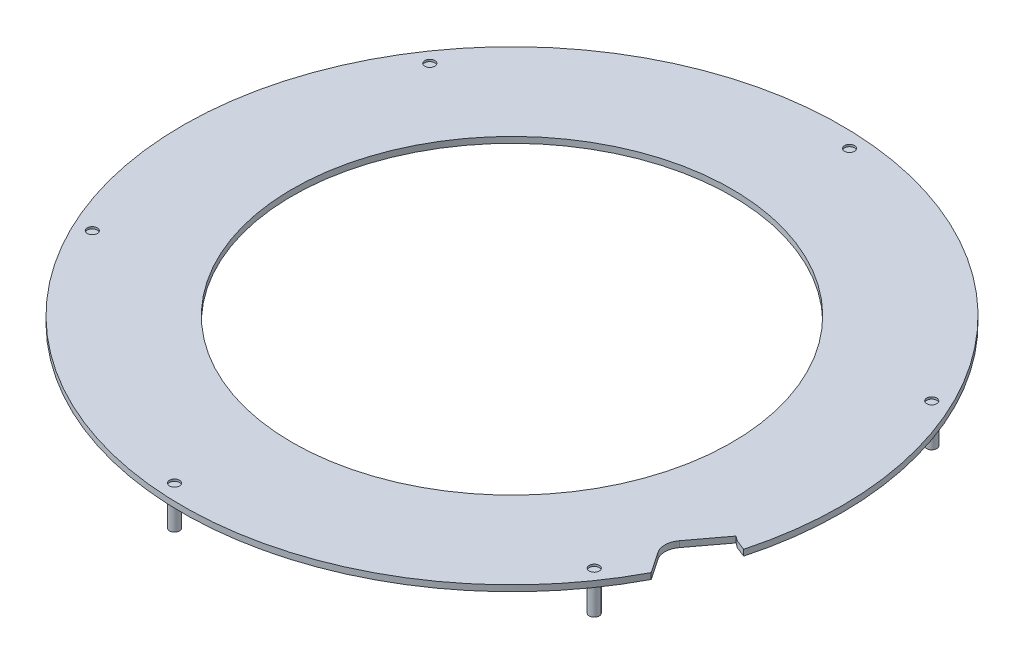
ISO-10303-21;
HEADER;
FILE_DESCRIPTION(('STEP AP214'),'2;1');
FILE_NAME('part.step','',(''),(''),'','','');
FILE_SCHEMA(('AUTOMOTIVE_DESIGN { 1 0 10303 214 1 1 1 1 }'));
ENDSEC;
DATA;
#1=APPLICATION_CONTEXT('core data for automotive mechanical design processes');
#2=APPLICATION_PROTOCOL_DEFINITION('international standard','automotive_design',2000,#1);
#3=PRODUCT_CONTEXT('',#1,'mechanical');
#4=PRODUCT('Part','Part','',(#3));
#5=PRODUCT_RELATED_PRODUCT_CATEGORY('part','',(#4));
#6=PRODUCT_DEFINITION_FORMATION('','',#4);
#7=PRODUCT_DEFINITION_CONTEXT('part definition',#1,'design');
#8=PRODUCT_DEFINITION('design','',#6,#7);
#9=PRODUCT_DEFINITION_SHAPE('','',#8);
#10=(LENGTH_UNIT() NAMED_UNIT(*) SI_UNIT(.MILLI.,.METRE.));
#11=(NAMED_UNIT(*) PLANE_ANGLE_UNIT() SI_UNIT($,.RADIAN.));
#12=(NAMED_UNIT(*) SI_UNIT($,.STERADIAN.) SOLID_ANGLE_UNIT());
#13=UNCERTAINTY_MEASURE_WITH_UNIT(LENGTH_MEASURE(1.E-05),#10,'distance_accuracy_value','');
#14=(GEOMETRIC_REPRESENTATION_CONTEXT(3) GLOBAL_UNCERTAINTY_ASSIGNED_CONTEXT((#13)) GLOBAL_UNIT_ASSIGNED_CONTEXT((#10,
#11,#12)) REPRESENTATION_CONTEXT('',''));
#15=CARTESIAN_POINT('',(0.,0.,0.));
#16=DIRECTION('',(0.,0.,1.));
#17=DIRECTION('',(1.,0.,0.));
#18=AXIS2_PLACEMENT_3D('',#15,#16,#17);
#19=CARTESIAN_POINT('',(0.,3.,0.));
#20=DIRECTION('',(0.,1.,0.));
#21=DIRECTION('',(0.,0.,1.));
#22=AXIS2_PLACEMENT_3D('',#19,#20,#21);
#23=PLANE('',#22);
#24=CARTESIAN_POINT('',(-130.034414333426,3.,-88.8667603154464));
#25=DIRECTION('',(0.,1.,0.));
#26=DIRECTION('',(0.86602540378444,0.,0.499999999999998));
#27=AXIS2_PLACEMENT_3D('',#24,#25,#26);
#28=CIRCLE('',#27,2.50000000000001);
#29=CARTESIAN_POINT('',(-127.869350823964,3.,-87.6167603154464));
#30=VERTEX_POINT('',#29);
#31=EDGE_CURVE('E325',#30,#30,#28,.T.);
#32=ORIENTED_EDGE('',*,*,#31,.F.);
#33=EDGE_LOOP('',(#32));
#34=FACE_BOUND('',#33,.T.);
#35=CARTESIAN_POINT('',(-141.978079151912,3.,68.179726021255));
#36=DIRECTION('',(0.,1.,0.));
#37=DIRECTION('',(0.866025403784436,0.,-0.500000000000004));
#38=AXIS2_PLACEMENT_3D('',#35,#36,#37);
#39=CIRCLE('',#38,2.50000000000001);
#40=CARTESIAN_POINT('',(-139.813015642451,3.,66.929726021255));
#41=VERTEX_POINT('',#40);
#42=EDGE_CURVE('E332',#41,#41,#39,.T.);
#43=ORIENTED_EDGE('',*,*,#42,.F.);
#44=EDGE_LOOP('',(#43));
#45=FACE_BOUND('',#44,.T.);
#46=CARTESIAN_POINT('',(-11.9436648184869,3.,157.046486336701));
#47=DIRECTION('',(0.,1.,0.));
#48=DIRECTION('',(0.,0.,-1.));
#49=AXIS2_PLACEMENT_3D('',#46,#47,#48);
#50=CIRCLE('',#49,2.50000000000001);
#51=CARTESIAN_POINT('',(-11.9436648184869,3.,154.546486336701));
#52=VERTEX_POINT('',#51);
#53=EDGE_CURVE('E338',#52,#52,#50,.T.);
#54=ORIENTED_EDGE('',*,*,#53,.F.);
#55=EDGE_LOOP('',(#54));
#56=FACE_BOUND('',#55,.T.);
#57=CARTESIAN_POINT('',(130.034414333426,3.,88.8667603154455));
#58=DIRECTION('',(0.,1.,0.));
#59=DIRECTION('',(-0.866025403784443,0.,-0.499999999999992));
#60=AXIS2_PLACEMENT_3D('',#57,#58,#59);
#61=CIRCLE('',#60,2.50000000000001);
#62=CARTESIAN_POINT('',(127.869350823965,3.,87.6167603154455));
#63=VERTEX_POINT('',#62);
#64=EDGE_CURVE('E344',#63,#63,#61,.T.);
#65=ORIENTED_EDGE('',*,*,#64,.F.);
#66=EDGE_LOOP('',(#65));
#67=FACE_BOUND('',#66,.T.);
#68=CARTESIAN_POINT('',(141.978079151912,3.,-68.179726021256));
#69=DIRECTION('',(0.,1.,0.));
#70=DIRECTION('',(-0.866025403784433,0.,0.50000000000001));
#71=AXIS2_PLACEMENT_3D('',#68,#69,#70);
#72=CIRCLE('',#71,2.50000000000001);
#73=CARTESIAN_POINT('',(139.81301564245,3.,-66.929726021256));
#74=VERTEX_POINT('',#73);
#75=EDGE_CURVE('E350',#74,#74,#72,.T.);
#76=ORIENTED_EDGE('',*,*,#75,.F.);
#77=EDGE_LOOP('',(#76));
#78=FACE_BOUND('',#77,.T.);
#79=CARTESIAN_POINT('',(11.9436648184869,3.,-157.046486336701));
#80=DIRECTION('',(0.,1.,0.));
#81=DIRECTION('',(0.,0.,1.));
#82=AXIS2_PLACEMENT_3D('',#79,#80,#81);
#83=CIRCLE('',#82,2.50000000000001);
#84=CARTESIAN_POINT('',(11.9436648184869,3.,-154.546486336701));
#85=VERTEX_POINT('',#84);
#86=EDGE_CURVE('E324',#85,#85,#83,.T.);
#87=ORIENTED_EDGE('',*,*,#86,.F.);
#88=EDGE_LOOP('',(#87));
#89=FACE_BOUND('',#88,.T.);
#90=DIRECTION('',(0.559555238153662,0.,0.828793059487589));
#91=VECTOR('',#90,1.);
#92=CARTESIAN_POINT('',(64.936029715868,3.,-43.8412160387546));
#93=LINE('',#92,#91);
#94=CARTESIAN_POINT('',(139.162211830197,3.,66.0999307399016));
#95=VERTEX_POINT('',#94);
#96=CARTESIAN_POINT('',(146.18965414879,3.,76.5087251224142));
#97=VERTEX_POINT('',#96);
#98=EDGE_CURVE('E128',#95,#97,#93,.T.);
#99=ORIENTED_EDGE('',*,*,#98,.F.);
#100=CARTESIAN_POINT('',(146.621349365585,3.,61.0639335965184));
#101=DIRECTION('',(0.,1.,0.));
#102=DIRECTION('',(0.,0.,1.));
#103=AXIS2_PLACEMENT_3D('',#100,#101,#102);
#104=CIRCLE('',#103,9.00000000000006);
#105=CARTESIAN_POINT('',(139.418207286111,3.,55.668125577054));
#106=VERTEX_POINT('',#105);
#107=EDGE_CURVE('E132',#106,#95,#104,.T.);
#108=ORIENTED_EDGE('',*,*,#107,.F.);
#109=DIRECTION('',(-0.599534224384919,0.,0.800349119941525));
#110=VECTOR('',#109,1.);
#111=CARTESIAN_POINT('',(116.017156590271,3.,86.907393609396));
#112=LINE('',#111,#110);
#113=CARTESIAN_POINT('',(151.593681380399,3.,39.4144580133197));
#114=VERTEX_POINT('',#113);
#115=EDGE_CURVE('E96',#114,#106,#112,.T.);
#116=ORIENTED_EDGE('',*,*,#115,.F.);
#117=DIRECTION('',(-0.800349119941534,0.,-0.599534224384908));
#118=VECTOR('',#117,1.);
#119=CARTESIAN_POINT('',(35.5765247901258,3.,-47.4929355960752));
#120=LINE('',#119,#118);
#121=CARTESIAN_POINT('',(153.89000031285,3.,41.1346095769374));
#122=VERTEX_POINT('',#121);
#123=EDGE_CURVE('E58',#122,#114,#120,.T.);
#124=ORIENTED_EDGE('',*,*,#123,.F.);
#125=DIRECTION('',(-0.927663239871869,0.,-0.373417880383931));
#126=VECTOR('',#125,1.);
#127=CARTESIAN_POINT('',(7.20928496421925,3.,-17.9096636727494));
#128=LINE('',#127,#126);
#129=CARTESIAN_POINT('',(159.222327431221,3.,43.2810633809398));
#130=VERTEX_POINT('',#129);
#131=EDGE_CURVE('E123',#130,#122,#128,.T.);
#132=ORIENTED_EDGE('',*,*,#131,.F.);
#133=CARTESIAN_POINT('',(0.,3.,0.));
#134=DIRECTION('',(0.,1.,0.));
#135=DIRECTION('',(0.,0.,1.));
#136=AXIS2_PLACEMENT_3D('',#133,#134,#135);
#137=CIRCLE('',#136,165.);
#138=EDGE_CURVE('E159',#130,#97,#137,.T.);
#139=ORIENTED_EDGE('',*,*,#138,.T.);
#140=EDGE_LOOP('',(#99,#108,#116,#124,#132,#139));
#141=FACE_BOUND('',#140,.T.);
#142=CARTESIAN_POINT('',(0.,3.,0.));
#143=DIRECTION('',(0.,1.,0.));
#144=DIRECTION('',(0.,0.,1.));
#145=AXIS2_PLACEMENT_3D('',#142,#143,#144);
#146=CIRCLE('',#145,110.);
#147=CARTESIAN_POINT('',(0.,3.,110.));
#148=VERTEX_POINT('',#147);
#149=EDGE_CURVE('E153',#148,#148,#146,.T.);
#150=ORIENTED_EDGE('',*,*,#149,.F.);
#151=EDGE_LOOP('',(#150));
#152=FACE_BOUND('',#151,.T.);
#153=ADVANCED_FACE('F35',(#34,#45,#56,#67,#78,#89,#141,#152),#23,.T.);
#154=CARTESIAN_POINT('',(0.,0.,0.));
#155=DIRECTION('',(0.,1.,0.));
#156=DIRECTION('',(0.,0.,1.));
#157=AXIS2_PLACEMENT_3D('',#154,#155,#156);
#158=PLANE('',#157);
#159=CARTESIAN_POINT('',(-141.978079151912,0.,68.179726021256));
#160=DIRECTION('',(0.,1.,0.));
#161=DIRECTION('',(0.,0.,1.));
#162=AXIS2_PLACEMENT_3D('',#159,#160,#161);
#163=CIRCLE('',#162,2.5);
#164=CARTESIAN_POINT('',(-141.978079151912,0.,70.679726021256));
#165=VERTEX_POINT('',#164);
#166=EDGE_CURVE('E179',#165,#165,#163,.F.);
#167=ORIENTED_EDGE('',*,*,#166,.F.);
#168=EDGE_LOOP('',(#167));
#169=FACE_BOUND('',#168,.T.);
#170=CARTESIAN_POINT('',(-130.034414333426,0.,-88.8667603154455));
#171=DIRECTION('',(0.,1.,0.));
#172=DIRECTION('',(0.,0.,1.));
#173=AXIS2_PLACEMENT_3D('',#170,#171,#172);
#174=CIRCLE('',#173,2.5);
#175=CARTESIAN_POINT('',(-130.034414333426,0.,-86.3667603154455));
#176=VERTEX_POINT('',#175);
#177=EDGE_CURVE('E176',#176,#176,#174,.F.);
#178=ORIENTED_EDGE('',*,*,#177,.F.);
#179=EDGE_LOOP('',(#178));
#180=FACE_BOUND('',#179,.T.);
#181=CARTESIAN_POINT('',(11.9436648184869,0.,-157.046486336701));
#182=DIRECTION('',(0.,1.,0.));
#183=DIRECTION('',(0.,0.,1.));
#184=AXIS2_PLACEMENT_3D('',#181,#182,#183);
#185=CIRCLE('',#184,2.5);
#186=CARTESIAN_POINT('',(11.9436648184869,0.,-154.546486336701));
#187=VERTEX_POINT('',#186);
#188=EDGE_CURVE('E173',#187,#187,#185,.F.);
#189=ORIENTED_EDGE('',*,*,#188,.F.);
#190=EDGE_LOOP('',(#189));
#191=FACE_BOUND('',#190,.T.);
#192=CARTESIAN_POINT('',(141.978079151912,0.,-68.179726021255));
#193=DIRECTION('',(0.,1.,0.));
#194=DIRECTION('',(0.,0.,1.));
#195=AXIS2_PLACEMENT_3D('',#192,#193,#194);
#196=CIRCLE('',#195,2.5);
#197=CARTESIAN_POINT('',(141.978079151912,0.,-65.679726021255));
#198=VERTEX_POINT('',#197);
#199=EDGE_CURVE('E170',#198,#198,#196,.F.);
#200=ORIENTED_EDGE('',*,*,#199,.F.);
#201=EDGE_LOOP('',(#200));
#202=FACE_BOUND('',#201,.T.);
#203=CARTESIAN_POINT('',(130.034414333426,0.,88.8667603154464));
#204=DIRECTION('',(0.,1.,0.));
#205=DIRECTION('',(0.,0.,1.));
#206=AXIS2_PLACEMENT_3D('',#203,#204,#205);
#207=CIRCLE('',#206,2.5);
#208=CARTESIAN_POINT('',(130.034414333426,0.,91.3667603154464));
#209=VERTEX_POINT('',#208);
#210=EDGE_CURVE('E167',#209,#209,#207,.F.);
#211=ORIENTED_EDGE('',*,*,#210,.F.);
#212=EDGE_LOOP('',(#211));
#213=FACE_BOUND('',#212,.T.);
#214=CARTESIAN_POINT('',(-11.9436648184869,0.,157.046486336701));
#215=DIRECTION('',(0.,1.,0.));
#216=DIRECTION('',(0.,0.,1.));
#217=AXIS2_PLACEMENT_3D('',#214,#215,#216);
#218=CIRCLE('',#217,2.5);
#219=CARTESIAN_POINT('',(-11.9436648184869,0.,159.546486336701));
#220=VERTEX_POINT('',#219);
#221=EDGE_CURVE('E162',#220,#220,#218,.F.);
#222=ORIENTED_EDGE('',*,*,#221,.F.);
#223=EDGE_LOOP('',(#222));
#224=FACE_BOUND('',#223,.T.);
#225=CARTESIAN_POINT('',(146.621349365585,0.,61.0639335965184));
#226=DIRECTION('',(0.,-1.,0.));
#227=DIRECTION('',(0.,0.,-1.));
#228=AXIS2_PLACEMENT_3D('',#225,#226,#227);
#229=CIRCLE('',#228,9.00000000000006);
#230=CARTESIAN_POINT('',(139.162211830197,0.,66.0999307399016));
#231=VERTEX_POINT('',#230);
#232=CARTESIAN_POINT('',(139.418207286111,0.,55.668125577054));
#233=VERTEX_POINT('',#232);
#234=EDGE_CURVE('E103',#231,#233,#229,.T.);
#235=ORIENTED_EDGE('',*,*,#234,.F.);
#236=DIRECTION('',(-0.559555238153662,0.,-0.828793059487589));
#237=VECTOR('',#236,1.);
#238=CARTESIAN_POINT('',(146.824907268627,0.,77.4496391570611));
#239=LINE('',#238,#237);
#240=CARTESIAN_POINT('',(146.18965414879,0.,76.5087251224142));
#241=VERTEX_POINT('',#240);
#242=EDGE_CURVE('E100',#241,#231,#239,.T.);
#243=ORIENTED_EDGE('',*,*,#242,.F.);
#244=CARTESIAN_POINT('',(0.,0.,0.));
#245=DIRECTION('',(0.,1.,0.));
#246=DIRECTION('',(0.,0.,1.));
#247=AXIS2_PLACEMENT_3D('',#244,#245,#246);
#248=CIRCLE('',#247,165.);
#249=CARTESIAN_POINT('',(159.222327431221,0.,43.2810633809397));
#250=VERTEX_POINT('',#249);
#251=EDGE_CURVE('E156',#250,#241,#248,.T.);
#252=ORIENTED_EDGE('',*,*,#251,.F.);
#253=DIRECTION('',(0.927663239871868,0.,0.373417880383931));
#254=VECTOR('',#253,1.);
#255=CARTESIAN_POINT('',(153.89000031285,0.,41.1346095769374));
#256=LINE('',#255,#254);
#257=CARTESIAN_POINT('',(153.89000031285,0.,41.1346095769374));
#258=VERTEX_POINT('',#257);
#259=EDGE_CURVE('E50',#258,#250,#256,.T.);
#260=ORIENTED_EDGE('',*,*,#259,.F.);
#261=DIRECTION('',(0.800349119941533,0.,0.599534224384908));
#262=VECTOR('',#261,1.);
#263=CARTESIAN_POINT('',(151.593681380399,0.,39.4144580133197));
#264=LINE('',#263,#262);
#265=CARTESIAN_POINT('',(151.593681380399,0.,39.4144580133197));
#266=VERTEX_POINT('',#265);
#267=EDGE_CURVE('E115',#266,#258,#264,.T.);
#268=ORIENTED_EDGE('',*,*,#267,.F.);
#269=DIRECTION('',(0.599534224384919,0.,-0.800349119941525));
#270=VECTOR('',#269,1.);
#271=CARTESIAN_POINT('',(139.418207286111,0.,55.668125577054));
#272=LINE('',#271,#270);
#273=EDGE_CURVE('E93',#233,#266,#272,.T.);
#274=ORIENTED_EDGE('',*,*,#273,.F.);
#275=EDGE_LOOP('',(#235,#243,#252,#260,#268,#274));
#276=FACE_BOUND('',#275,.T.);
#277=CARTESIAN_POINT('',(0.,0.,0.));
#278=DIRECTION('',(0.,1.,0.));
#279=DIRECTION('',(0.,0.,1.));
#280=AXIS2_PLACEMENT_3D('',#277,#278,#279);
#281=CIRCLE('',#280,110.);
#282=CARTESIAN_POINT('',(0.,0.,110.));
#283=VERTEX_POINT('',#282);
#284=EDGE_CURVE('E152',#283,#283,#281,.T.);
#285=ORIENTED_EDGE('',*,*,#284,.T.);
#286=EDGE_LOOP('',(#285));
#287=FACE_BOUND('',#286,.T.);
#288=ADVANCED_FACE('F112',(#169,#180,#191,#202,#213,#224,#276,#287),#158,.F.);
#289=CARTESIAN_POINT('',(0.,3.,0.));
#290=DIRECTION('',(0.,-1.,0.));
#291=DIRECTION('',(0.,0.,-1.));
#292=AXIS2_PLACEMENT_3D('',#289,#290,#291);
#293=CYLINDRICAL_SURFACE('',#292,165.);
#294=ORIENTED_EDGE('',*,*,#251,.T.);
#295=DIRECTION('',(0.,-1.,0.));
#296=VECTOR('',#295,1.);
#297=CARTESIAN_POINT('',(146.18965414879,3.,76.5087251224142));
#298=LINE('',#297,#296);
#299=EDGE_CURVE('E11',#241,#97,#298,.F.);
#300=ORIENTED_EDGE('',*,*,#299,.T.);
#301=ORIENTED_EDGE('',*,*,#138,.F.);
#302=DIRECTION('',(0.,-1.,0.));
#303=VECTOR('',#302,1.);
#304=CARTESIAN_POINT('',(159.222327431221,3.,43.2810633809398));
#305=LINE('',#304,#303);
#306=EDGE_CURVE('E43',#130,#250,#305,.T.);
#307=ORIENTED_EDGE('',*,*,#306,.T.);
#308=EDGE_LOOP('',(#294,#300,#301,#307));
#309=FACE_BOUND('',#308,.T.);
#310=ADVANCED_FACE('F37',(#309),#293,.T.);
#311=CARTESIAN_POINT('',(0.,3.,0.));
#312=DIRECTION('',(0.,-1.,0.));
#313=DIRECTION('',(0.,0.,-1.));
#314=AXIS2_PLACEMENT_3D('',#311,#312,#313);
#315=CYLINDRICAL_SURFACE('',#314,110.);
#316=ORIENTED_EDGE('',*,*,#149,.T.);
#317=EDGE_LOOP('',(#316));
#318=FACE_BOUND('',#317,.T.);
#319=ORIENTED_EDGE('',*,*,#284,.F.);
#320=EDGE_LOOP('',(#319));
#321=FACE_BOUND('',#320,.T.);
#322=ADVANCED_FACE('F213',(#318,#321),#315,.F.);
#323=CARTESIAN_POINT('',(-11.9436648184869,-16.5,157.046486336701));
#324=DIRECTION('',(0.,1.,0.));
#325=DIRECTION('',(0.,0.,1.));
#326=AXIS2_PLACEMENT_3D('',#323,#324,#325);
#327=CYLINDRICAL_SURFACE('',#326,2.5);
#328=CARTESIAN_POINT('',(-11.9436648184869,-16.5,157.046486336701));
#329=DIRECTION('',(0.,-1.,0.));
#330=DIRECTION('',(0.,0.,-1.));
#331=AXIS2_PLACEMENT_3D('',#328,#329,#330);
#332=CIRCLE('',#331,2.5);
#333=CARTESIAN_POINT('',(-11.9436648184869,-16.5,154.546486336701));
#334=VERTEX_POINT('',#333);
#335=EDGE_CURVE('E149',#334,#334,#332,.T.);
#336=ORIENTED_EDGE('',*,*,#335,.F.);
#337=EDGE_LOOP('',(#336));
#338=FACE_BOUND('',#337,.T.);
#339=ORIENTED_EDGE('',*,*,#221,.T.);
#340=EDGE_LOOP('',(#339));
#341=FACE_BOUND('',#340,.T.);
#342=ADVANCED_FACE('F216',(#338,#341),#327,.T.);
#343=CARTESIAN_POINT('',(-11.9436648184869,-16.5,157.046486336701));
#344=DIRECTION('',(0.,-1.,0.));
#345=DIRECTION('',(0.,0.,-1.));
#346=AXIS2_PLACEMENT_3D('',#343,#344,#345);
#347=PLANE('',#346);
#348=ORIENTED_EDGE('',*,*,#335,.T.);
#349=EDGE_LOOP('',(#348));
#350=FACE_BOUND('',#349,.T.);
#351=ADVANCED_FACE('F220',(#350),#347,.T.);
#352=CARTESIAN_POINT('',(130.034414333426,-16.5,88.8667603154464));
#353=DIRECTION('',(0.,1.,0.));
#354=DIRECTION('',(0.86602540378444,0.,0.499999999999998));
#355=AXIS2_PLACEMENT_3D('',#352,#353,#354);
#356=CYLINDRICAL_SURFACE('',#355,2.5);
#357=CARTESIAN_POINT('',(130.034414333426,-16.5,88.8667603154464));
#358=DIRECTION('',(0.,-1.,0.));
#359=DIRECTION('',(-0.86602540378444,0.,-0.499999999999998));
#360=AXIS2_PLACEMENT_3D('',#357,#358,#359);
#361=CIRCLE('',#360,2.5);
#362=CARTESIAN_POINT('',(127.869350823964,-16.5,87.6167603154464));
#363=VERTEX_POINT('',#362);
#364=EDGE_CURVE('E146',#363,#363,#361,.T.);
#365=ORIENTED_EDGE('',*,*,#364,.F.);
#366=EDGE_LOOP('',(#365));
#367=FACE_BOUND('',#366,.T.);
#368=ORIENTED_EDGE('',*,*,#210,.T.);
#369=EDGE_LOOP('',(#368));
#370=FACE_BOUND('',#369,.T.);
#371=ADVANCED_FACE('F224',(#367,#370),#356,.T.);
#372=CARTESIAN_POINT('',(130.034414333426,-16.5,88.8667603154464));
#373=DIRECTION('',(0.,-1.,0.));
#374=DIRECTION('',(-0.86602540378444,0.,-0.499999999999998));
#375=AXIS2_PLACEMENT_3D('',#372,#373,#374);
#376=PLANE('',#375);
#377=ORIENTED_EDGE('',*,*,#364,.T.);
#378=EDGE_LOOP('',(#377));
#379=FACE_BOUND('',#378,.T.);
#380=ADVANCED_FACE('F228',(#379),#376,.T.);
#381=CARTESIAN_POINT('',(141.978079151912,-16.5,-68.179726021255));
#382=DIRECTION('',(0.,1.,0.));
#383=DIRECTION('',(0.866025403784436,0.,-0.500000000000004));
#384=AXIS2_PLACEMENT_3D('',#381,#382,#383);
#385=CYLINDRICAL_SURFACE('',#384,2.5);
#386=CARTESIAN_POINT('',(141.978079151912,-16.5,-68.179726021255));
#387=DIRECTION('',(0.,-1.,0.));
#388=DIRECTION('',(-0.866025403784436,0.,0.500000000000004));
#389=AXIS2_PLACEMENT_3D('',#386,#387,#388);
#390=CIRCLE('',#389,2.5);
#391=CARTESIAN_POINT('',(139.813015642451,-16.5,-66.929726021255));
#392=VERTEX_POINT('',#391);
#393=EDGE_CURVE('E143',#392,#392,#390,.T.);
#394=ORIENTED_EDGE('',*,*,#393,.F.);
#395=EDGE_LOOP('',(#394));
#396=FACE_BOUND('',#395,.T.);
#397=ORIENTED_EDGE('',*,*,#199,.T.);
#398=EDGE_LOOP('',(#397));
#399=FACE_BOUND('',#398,.T.);
#400=ADVANCED_FACE('F232',(#396,#399),#385,.T.);
#401=CARTESIAN_POINT('',(141.978079151912,-16.5,-68.179726021255));
#402=DIRECTION('',(0.,-1.,0.));
#403=DIRECTION('',(-0.866025403784436,0.,0.500000000000004));
#404=AXIS2_PLACEMENT_3D('',#401,#402,#403);
#405=PLANE('',#404);
#406=ORIENTED_EDGE('',*,*,#393,.T.);
#407=EDGE_LOOP('',(#406));
#408=FACE_BOUND('',#407,.T.);
#409=ADVANCED_FACE('F236',(#408),#405,.T.);
#410=CARTESIAN_POINT('',(11.9436648184869,-16.5,-157.046486336701));
#411=DIRECTION('',(0.,1.,0.));
#412=DIRECTION('',(0.,0.,-1.));
#413=AXIS2_PLACEMENT_3D('',#410,#411,#412);
#414=CYLINDRICAL_SURFACE('',#413,2.5);
#415=CARTESIAN_POINT('',(11.9436648184869,-16.5,-157.046486336701));
#416=DIRECTION('',(0.,-1.,0.));
#417=DIRECTION('',(0.,0.,1.));
#418=AXIS2_PLACEMENT_3D('',#415,#416,#417);
#419=CIRCLE('',#418,2.5);
#420=CARTESIAN_POINT('',(11.9436648184869,-16.5,-154.546486336701));
#421=VERTEX_POINT('',#420);
#422=EDGE_CURVE('E140',#421,#421,#419,.T.);
#423=ORIENTED_EDGE('',*,*,#422,.F.);
#424=EDGE_LOOP('',(#423));
#425=FACE_BOUND('',#424,.T.);
#426=ORIENTED_EDGE('',*,*,#188,.T.);
#427=EDGE_LOOP('',(#426));
#428=FACE_BOUND('',#427,.T.);
#429=ADVANCED_FACE('F240',(#425,#428),#414,.T.);
#430=CARTESIAN_POINT('',(11.9436648184869,-16.5,-157.046486336701));
#431=DIRECTION('',(0.,-1.,0.));
#432=DIRECTION('',(0.,0.,1.));
#433=AXIS2_PLACEMENT_3D('',#430,#431,#432);
#434=PLANE('',#433);
#435=ORIENTED_EDGE('',*,*,#422,.T.);
#436=EDGE_LOOP('',(#435));
#437=FACE_BOUND('',#436,.T.);
#438=ADVANCED_FACE('F244',(#437),#434,.T.);
#439=CARTESIAN_POINT('',(-130.034414333426,-16.5,-88.8667603154455));
#440=DIRECTION('',(0.,1.,0.));
#441=DIRECTION('',(-0.866025403784443,0.,-0.499999999999992));
#442=AXIS2_PLACEMENT_3D('',#439,#440,#441);
#443=CYLINDRICAL_SURFACE('',#442,2.5);
#444=CARTESIAN_POINT('',(-130.034414333426,-16.5,-88.8667603154455));
#445=DIRECTION('',(0.,-1.,0.));
#446=DIRECTION('',(0.866025403784443,0.,0.499999999999992));
#447=AXIS2_PLACEMENT_3D('',#444,#445,#446);
#448=CIRCLE('',#447,2.5);
#449=CARTESIAN_POINT('',(-127.869350823965,-16.5,-87.6167603154455));
#450=VERTEX_POINT('',#449);
#451=EDGE_CURVE('E137',#450,#450,#448,.T.);
#452=ORIENTED_EDGE('',*,*,#451,.F.);
#453=EDGE_LOOP('',(#452));
#454=FACE_BOUND('',#453,.T.);
#455=ORIENTED_EDGE('',*,*,#177,.T.);
#456=EDGE_LOOP('',(#455));
#457=FACE_BOUND('',#456,.T.);
#458=ADVANCED_FACE('F248',(#454,#457),#443,.T.);
#459=CARTESIAN_POINT('',(-130.034414333426,-16.5,-88.8667603154455));
#460=DIRECTION('',(0.,-1.,0.));
#461=DIRECTION('',(0.866025403784443,0.,0.499999999999992));
#462=AXIS2_PLACEMENT_3D('',#459,#460,#461);
#463=PLANE('',#462);
#464=ORIENTED_EDGE('',*,*,#451,.T.);
#465=EDGE_LOOP('',(#464));
#466=FACE_BOUND('',#465,.T.);
#467=ADVANCED_FACE('F252',(#466),#463,.T.);
#468=CARTESIAN_POINT('',(-141.978079151912,-16.5,68.179726021256));
#469=DIRECTION('',(0.,1.,0.));
#470=DIRECTION('',(-0.866025403784433,0.,0.50000000000001));
#471=AXIS2_PLACEMENT_3D('',#468,#469,#470);
#472=CYLINDRICAL_SURFACE('',#471,2.5);
#473=CARTESIAN_POINT('',(-141.978079151912,-16.5,68.179726021256));
#474=DIRECTION('',(0.,-1.,0.));
#475=DIRECTION('',(0.866025403784433,0.,-0.50000000000001));
#476=AXIS2_PLACEMENT_3D('',#473,#474,#475);
#477=CIRCLE('',#476,2.5);
#478=CARTESIAN_POINT('',(-139.81301564245,-16.5,66.929726021256));
#479=VERTEX_POINT('',#478);
#480=EDGE_CURVE('E134',#479,#479,#477,.T.);
#481=ORIENTED_EDGE('',*,*,#480,.F.);
#482=EDGE_LOOP('',(#481));
#483=FACE_BOUND('',#482,.T.);
#484=ORIENTED_EDGE('',*,*,#166,.T.);
#485=EDGE_LOOP('',(#484));
#486=FACE_BOUND('',#485,.T.);
#487=ADVANCED_FACE('F256',(#483,#486),#472,.T.);
#488=CARTESIAN_POINT('',(-141.978079151912,-16.5,68.179726021256));
#489=DIRECTION('',(0.,-1.,0.));
#490=DIRECTION('',(0.866025403784433,0.,-0.50000000000001));
#491=AXIS2_PLACEMENT_3D('',#488,#489,#490);
#492=PLANE('',#491);
#493=ORIENTED_EDGE('',*,*,#480,.T.);
#494=EDGE_LOOP('',(#493));
#495=FACE_BOUND('',#494,.T.);
#496=ADVANCED_FACE('F260',(#495),#492,.T.);
#497=CARTESIAN_POINT('',(146.621349365585,10.,61.0639335965184));
#498=DIRECTION('',(0.,-1.,0.));
#499=DIRECTION('',(0.,0.,-1.));
#500=AXIS2_PLACEMENT_3D('',#497,#498,#499);
#501=CYLINDRICAL_SURFACE('',#500,9.00000000000006);
#502=ORIENTED_EDGE('',*,*,#107,.T.);
#503=DIRECTION('',(0.,-1.,0.));
#504=VECTOR('',#503,1.);
#505=CARTESIAN_POINT('',(139.162211830197,10.,66.0999307399016));
#506=LINE('',#505,#504);
#507=EDGE_CURVE('E106',#95,#231,#506,.T.);
#508=ORIENTED_EDGE('',*,*,#507,.T.);
#509=ORIENTED_EDGE('',*,*,#234,.T.);
#510=DIRECTION('',(0.,-1.,0.));
#511=VECTOR('',#510,1.);
#512=CARTESIAN_POINT('',(139.418207286111,10.,55.668125577054));
#513=LINE('',#512,#511);
#514=EDGE_CURVE('E89',#106,#233,#513,.T.);
#515=ORIENTED_EDGE('',*,*,#514,.F.);
#516=EDGE_LOOP('',(#502,#508,#509,#515));
#517=FACE_BOUND('',#516,.T.);
#518=ADVANCED_FACE('F104',(#517),#501,.F.);
#519=CARTESIAN_POINT('',(146.824907268627,10.,77.4496391570611));
#520=DIRECTION('',(-0.828793059487589,0.,0.559555238153662));
#521=DIRECTION('',(0.559555238153662,0.,0.828793059487589));
#522=AXIS2_PLACEMENT_3D('',#519,#520,#521);
#523=PLANE('',#522);
#524=ORIENTED_EDGE('',*,*,#98,.T.);
#525=ORIENTED_EDGE('',*,*,#299,.F.);
#526=ORIENTED_EDGE('',*,*,#242,.T.);
#527=ORIENTED_EDGE('',*,*,#507,.F.);
#528=EDGE_LOOP('',(#524,#525,#526,#527));
#529=FACE_BOUND('',#528,.T.);
#530=ADVANCED_FACE('F186',(#529),#523,.F.);
#531=CARTESIAN_POINT('',(153.89000031285,10.,41.1346095769374));
#532=DIRECTION('',(0.373417880383931,0.,-0.927663239871869));
#533=DIRECTION('',(-0.927663239871869,0.,-0.373417880383931));
#534=AXIS2_PLACEMENT_3D('',#531,#532,#533);
#535=PLANE('',#534);
#536=ORIENTED_EDGE('',*,*,#131,.T.);
#537=DIRECTION('',(0.,-1.,0.));
#538=VECTOR('',#537,1.);
#539=CARTESIAN_POINT('',(153.89000031285,10.,41.1346095769374));
#540=LINE('',#539,#538);
#541=EDGE_CURVE('E124',#122,#258,#540,.T.);
#542=ORIENTED_EDGE('',*,*,#541,.T.);
#543=ORIENTED_EDGE('',*,*,#259,.T.);
#544=ORIENTED_EDGE('',*,*,#306,.F.);
#545=EDGE_LOOP('',(#536,#542,#543,#544));
#546=FACE_BOUND('',#545,.T.);
#547=ADVANCED_FACE('F190',(#546),#535,.F.);
#548=CARTESIAN_POINT('',(151.593681380399,10.,39.4144580133197));
#549=DIRECTION('',(0.599534224384908,0.,-0.800349119941533));
#550=DIRECTION('',(-0.800349119941534,0.,-0.599534224384908));
#551=AXIS2_PLACEMENT_3D('',#548,#549,#550);
#552=PLANE('',#551);
#553=ORIENTED_EDGE('',*,*,#123,.T.);
#554=DIRECTION('',(0.,-1.,0.));
#555=VECTOR('',#554,1.);
#556=CARTESIAN_POINT('',(151.593681380399,10.,39.4144580133197));
#557=LINE('',#556,#555);
#558=EDGE_CURVE('E99',#114,#266,#557,.T.);
#559=ORIENTED_EDGE('',*,*,#558,.T.);
#560=ORIENTED_EDGE('',*,*,#267,.T.);
#561=ORIENTED_EDGE('',*,*,#541,.F.);
#562=EDGE_LOOP('',(#553,#559,#560,#561));
#563=FACE_BOUND('',#562,.T.);
#564=ADVANCED_FACE('F191',(#563),#552,.F.);
#565=CARTESIAN_POINT('',(139.418207286111,10.,55.668125577054));
#566=DIRECTION('',(-0.800349119941525,0.,-0.599534224384919));
#567=DIRECTION('',(-0.599534224384919,0.,0.800349119941525));
#568=AXIS2_PLACEMENT_3D('',#565,#566,#567);
#569=PLANE('',#568);
#570=ORIENTED_EDGE('',*,*,#115,.T.);
#571=ORIENTED_EDGE('',*,*,#514,.T.);
#572=ORIENTED_EDGE('',*,*,#273,.T.);
#573=ORIENTED_EDGE('',*,*,#558,.F.);
#574=EDGE_LOOP('',(#570,#571,#572,#573));
#575=FACE_BOUND('',#574,.T.);
#576=ADVANCED_FACE('F91',(#575),#569,.F.);
#577=CARTESIAN_POINT('',(11.9436648184869,2.,-157.046486336701));
#578=DIRECTION('',(0.,1.,0.));
#579=DIRECTION('',(0.,0.,1.));
#580=AXIS2_PLACEMENT_3D('',#577,#578,#579);
#581=CYLINDRICAL_SURFACE('',#580,2.50000000000001);
#582=CARTESIAN_POINT('',(11.9436648184869,2.,-157.046486336701));
#583=DIRECTION('',(0.,1.,0.));
#584=DIRECTION('',(0.,0.,1.));
#585=AXIS2_PLACEMENT_3D('',#582,#583,#584);
#586=CIRCLE('',#585,2.50000000000001);
#587=CARTESIAN_POINT('',(11.9436648184869,2.,-154.546486336701));
#588=VERTEX_POINT('',#587);
#589=EDGE_CURVE('E110',#588,#588,#586,.T.);
#590=ORIENTED_EDGE('',*,*,#589,.F.);
#591=EDGE_LOOP('',(#590));
#592=FACE_BOUND('',#591,.T.);
#593=ORIENTED_EDGE('',*,*,#86,.T.);
#594=EDGE_LOOP('',(#593));
#595=FACE_BOUND('',#594,.T.);
#596=ADVANCED_FACE('F198',(#592,#595),#581,.F.);
#597=CARTESIAN_POINT('',(11.9436648184869,2.,-157.046486336701));
#598=DIRECTION('',(0.,1.,0.));
#599=DIRECTION('',(0.,0.,1.));
#600=AXIS2_PLACEMENT_3D('',#597,#598,#599);
#601=PLANE('',#600);
#602=ORIENTED_EDGE('',*,*,#589,.T.);
#603=EDGE_LOOP('',(#602));
#604=FACE_BOUND('',#603,.T.);
#605=ADVANCED_FACE('F275',(#604),#601,.T.);
#606=CARTESIAN_POINT('',(141.978079151912,2.,-68.179726021256));
#607=DIRECTION('',(0.,1.,0.));
#608=DIRECTION('',(-0.866025403784433,0.,0.50000000000001));
#609=AXIS2_PLACEMENT_3D('',#606,#607,#608);
#610=CYLINDRICAL_SURFACE('',#609,2.50000000000001);
#611=CARTESIAN_POINT('',(141.978079151912,2.,-68.179726021256));
#612=DIRECTION('',(0.,1.,0.));
#613=DIRECTION('',(-0.866025403784433,0.,0.50000000000001));
#614=AXIS2_PLACEMENT_3D('',#611,#612,#613);
#615=CIRCLE('',#614,2.50000000000001);
#616=CARTESIAN_POINT('',(139.81301564245,2.,-66.929726021256));
#617=VERTEX_POINT('',#616);
#618=EDGE_CURVE('E347',#617,#617,#615,.T.);
#619=ORIENTED_EDGE('',*,*,#618,.F.);
#620=EDGE_LOOP('',(#619));
#621=FACE_BOUND('',#620,.T.);
#622=ORIENTED_EDGE('',*,*,#75,.T.);
#623=EDGE_LOOP('',(#622));
#624=FACE_BOUND('',#623,.T.);
#625=ADVANCED_FACE('F279',(#621,#624),#610,.F.);
#626=CARTESIAN_POINT('',(141.978079151912,2.,-68.179726021256));
#627=DIRECTION('',(0.,1.,0.));
#628=DIRECTION('',(-0.866025403784433,0.,0.50000000000001));
#629=AXIS2_PLACEMENT_3D('',#626,#627,#628);
#630=PLANE('',#629);
#631=ORIENTED_EDGE('',*,*,#618,.T.);
#632=EDGE_LOOP('',(#631));
#633=FACE_BOUND('',#632,.T.);
#634=ADVANCED_FACE('F283',(#633),#630,.T.);
#635=CARTESIAN_POINT('',(130.034414333426,2.,88.8667603154455));
#636=DIRECTION('',(0.,1.,0.));
#637=DIRECTION('',(-0.866025403784443,0.,-0.499999999999992));
#638=AXIS2_PLACEMENT_3D('',#635,#636,#637);
#639=CYLINDRICAL_SURFACE('',#638,2.50000000000001);
#640=CARTESIAN_POINT('',(130.034414333426,2.,88.8667603154455));
#641=DIRECTION('',(0.,1.,0.));
#642=DIRECTION('',(-0.866025403784443,0.,-0.499999999999992));
#643=AXIS2_PLACEMENT_3D('',#640,#641,#642);
#644=CIRCLE('',#643,2.50000000000001);
#645=CARTESIAN_POINT('',(127.869350823965,2.,87.6167603154455));
#646=VERTEX_POINT('',#645);
#647=EDGE_CURVE('E341',#646,#646,#644,.T.);
#648=ORIENTED_EDGE('',*,*,#647,.F.);
#649=EDGE_LOOP('',(#648));
#650=FACE_BOUND('',#649,.T.);
#651=ORIENTED_EDGE('',*,*,#64,.T.);
#652=EDGE_LOOP('',(#651));
#653=FACE_BOUND('',#652,.T.);
#654=ADVANCED_FACE('F287',(#650,#653),#639,.F.);
#655=CARTESIAN_POINT('',(130.034414333426,2.,88.8667603154455));
#656=DIRECTION('',(0.,1.,0.));
#657=DIRECTION('',(-0.866025403784443,0.,-0.499999999999992));
#658=AXIS2_PLACEMENT_3D('',#655,#656,#657);
#659=PLANE('',#658);
#660=ORIENTED_EDGE('',*,*,#647,.T.);
#661=EDGE_LOOP('',(#660));
#662=FACE_BOUND('',#661,.T.);
#663=ADVANCED_FACE('F291',(#662),#659,.T.);
#664=CARTESIAN_POINT('',(-11.9436648184869,2.,157.046486336701));
#665=DIRECTION('',(0.,1.,0.));
#666=DIRECTION('',(0.,0.,-1.));
#667=AXIS2_PLACEMENT_3D('',#664,#665,#666);
#668=CYLINDRICAL_SURFACE('',#667,2.50000000000001);
#669=CARTESIAN_POINT('',(-11.9436648184869,2.,157.046486336701));
#670=DIRECTION('',(0.,1.,0.));
#671=DIRECTION('',(0.,0.,-1.));
#672=AXIS2_PLACEMENT_3D('',#669,#670,#671);
#673=CIRCLE('',#672,2.50000000000001);
#674=CARTESIAN_POINT('',(-11.9436648184869,2.,154.546486336701));
#675=VERTEX_POINT('',#674);
#676=EDGE_CURVE('E335',#675,#675,#673,.T.);
#677=ORIENTED_EDGE('',*,*,#676,.F.);
#678=EDGE_LOOP('',(#677));
#679=FACE_BOUND('',#678,.T.);
#680=ORIENTED_EDGE('',*,*,#53,.T.);
#681=EDGE_LOOP('',(#680));
#682=FACE_BOUND('',#681,.T.);
#683=ADVANCED_FACE('F295',(#679,#682),#668,.F.);
#684=CARTESIAN_POINT('',(-11.9436648184869,2.,157.046486336701));
#685=DIRECTION('',(0.,1.,0.));
#686=DIRECTION('',(0.,0.,-1.));
#687=AXIS2_PLACEMENT_3D('',#684,#685,#686);
#688=PLANE('',#687);
#689=ORIENTED_EDGE('',*,*,#676,.T.);
#690=EDGE_LOOP('',(#689));
#691=FACE_BOUND('',#690,.T.);
#692=ADVANCED_FACE('F299',(#691),#688,.T.);
#693=CARTESIAN_POINT('',(-141.978079151912,2.,68.179726021255));
#694=DIRECTION('',(0.,1.,0.));
#695=DIRECTION('',(0.866025403784436,0.,-0.500000000000004));
#696=AXIS2_PLACEMENT_3D('',#693,#694,#695);
#697=CYLINDRICAL_SURFACE('',#696,2.50000000000001);
#698=CARTESIAN_POINT('',(-141.978079151912,2.,68.179726021255));
#699=DIRECTION('',(0.,1.,0.));
#700=DIRECTION('',(0.866025403784436,0.,-0.500000000000004));
#701=AXIS2_PLACEMENT_3D('',#698,#699,#700);
#702=CIRCLE('',#701,2.50000000000001);
#703=CARTESIAN_POINT('',(-139.813015642451,2.,66.929726021255));
#704=VERTEX_POINT('',#703);
#705=EDGE_CURVE('E329',#704,#704,#702,.T.);
#706=ORIENTED_EDGE('',*,*,#705,.F.);
#707=EDGE_LOOP('',(#706));
#708=FACE_BOUND('',#707,.T.);
#709=ORIENTED_EDGE('',*,*,#42,.T.);
#710=EDGE_LOOP('',(#709));
#711=FACE_BOUND('',#710,.T.);
#712=ADVANCED_FACE('F303',(#708,#711),#697,.F.);
#713=CARTESIAN_POINT('',(-141.978079151912,2.,68.179726021255));
#714=DIRECTION('',(0.,1.,0.));
#715=DIRECTION('',(0.866025403784436,0.,-0.500000000000004));
#716=AXIS2_PLACEMENT_3D('',#713,#714,#715);
#717=PLANE('',#716);
#718=ORIENTED_EDGE('',*,*,#705,.T.);
#719=EDGE_LOOP('',(#718));
#720=FACE_BOUND('',#719,.T.);
#721=ADVANCED_FACE('F307',(#720),#717,.T.);
#722=CARTESIAN_POINT('',(-130.034414333426,2.,-88.8667603154464));
#723=DIRECTION('',(0.,1.,0.));
#724=DIRECTION('',(0.86602540378444,0.,0.499999999999998));
#725=AXIS2_PLACEMENT_3D('',#722,#723,#724);
#726=CYLINDRICAL_SURFACE('',#725,2.50000000000001);
#727=CARTESIAN_POINT('',(-130.034414333426,2.,-88.8667603154464));
#728=DIRECTION('',(0.,1.,0.));
#729=DIRECTION('',(0.86602540378444,0.,0.499999999999998));
#730=AXIS2_PLACEMENT_3D('',#727,#728,#729);
#731=CIRCLE('',#730,2.50000000000001);
#732=CARTESIAN_POINT('',(-127.869350823964,2.,-87.6167603154464));
#733=VERTEX_POINT('',#732);
#734=EDGE_CURVE('E323',#733,#733,#731,.T.);
#735=ORIENTED_EDGE('',*,*,#734,.F.);
#736=EDGE_LOOP('',(#735));
#737=FACE_BOUND('',#736,.T.);
#738=ORIENTED_EDGE('',*,*,#31,.T.);
#739=EDGE_LOOP('',(#738));
#740=FACE_BOUND('',#739,.T.);
#741=ADVANCED_FACE('F311',(#737,#740),#726,.F.);
#742=CARTESIAN_POINT('',(-130.034414333426,2.,-88.8667603154464));
#743=DIRECTION('',(0.,1.,0.));
#744=DIRECTION('',(0.86602540378444,0.,0.499999999999998));
#745=AXIS2_PLACEMENT_3D('',#742,#743,#744);
#746=PLANE('',#745);
#747=ORIENTED_EDGE('',*,*,#734,.T.);
#748=EDGE_LOOP('',(#747));
#749=FACE_BOUND('',#748,.T.);
#750=ADVANCED_FACE('F315',(#749),#746,.T.);
#751=CLOSED_SHELL('',(#153,#288,#310,#322,#342,#351,#371,#380,#400,#409,#429,#438,#458,#467,
#487,#496,#518,#530,#547,#564,#576,#596,#605,#625,#634,#654,#663,#683,#692,#712,#721,#741,#750));
#752=MANIFOLD_SOLID_BREP('B2',#751);
#753=ADVANCED_BREP_SHAPE_REPRESENTATION('',(#18,#752),#14);
#754=SHAPE_DEFINITION_REPRESENTATION(#9,#753);
ENDSEC;
END-ISO-10303-21;
